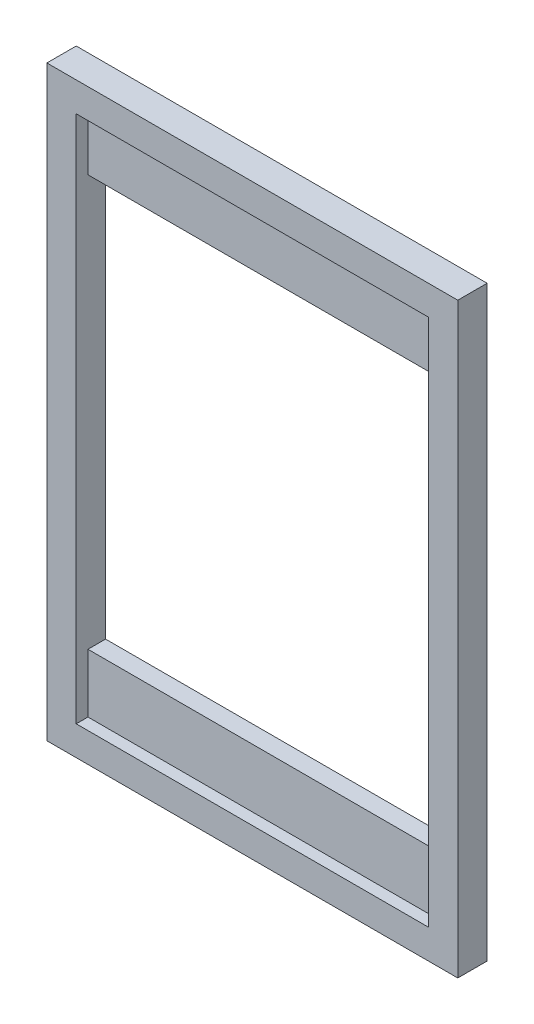
ISO-10303-21;
HEADER;
FILE_DESCRIPTION(('STEP AP214'),'2;1');
FILE_NAME('part.step','',(''),(''),'','','');
FILE_SCHEMA(('AUTOMOTIVE_DESIGN { 1 0 10303 214 1 1 1 1 }'));
ENDSEC;
DATA;
#1=APPLICATION_CONTEXT('core data for automotive mechanical design processes');
#2=APPLICATION_PROTOCOL_DEFINITION('international standard','automotive_design',2000,#1);
#3=PRODUCT_CONTEXT('',#1,'mechanical');
#4=PRODUCT('Part','Part','',(#3));
#5=PRODUCT_RELATED_PRODUCT_CATEGORY('part','',(#4));
#6=PRODUCT_DEFINITION_FORMATION('','',#4);
#7=PRODUCT_DEFINITION_CONTEXT('part definition',#1,'design');
#8=PRODUCT_DEFINITION('design','',#6,#7);
#9=PRODUCT_DEFINITION_SHAPE('','',#8);
#10=(LENGTH_UNIT() NAMED_UNIT(*) SI_UNIT(.MILLI.,.METRE.));
#11=(NAMED_UNIT(*) PLANE_ANGLE_UNIT() SI_UNIT($,.RADIAN.));
#12=(NAMED_UNIT(*) SI_UNIT($,.STERADIAN.) SOLID_ANGLE_UNIT());
#13=UNCERTAINTY_MEASURE_WITH_UNIT(LENGTH_MEASURE(1.E-05),#10,'distance_accuracy_value','');
#14=(GEOMETRIC_REPRESENTATION_CONTEXT(3) GLOBAL_UNCERTAINTY_ASSIGNED_CONTEXT((#13)) GLOBAL_UNIT_ASSIGNED_CONTEXT((#10,
#11,#12)) REPRESENTATION_CONTEXT('',''));
#15=CARTESIAN_POINT('',(0.,0.,0.));
#16=DIRECTION('',(0.,0.,1.));
#17=DIRECTION('',(1.,0.,0.));
#18=AXIS2_PLACEMENT_3D('',#15,#16,#17);
#19=CARTESIAN_POINT('',(-30.,-45.,0.));
#20=DIRECTION('',(1.,0.,0.));
#21=DIRECTION('',(0.,0.,-1.));
#22=AXIS2_PLACEMENT_3D('',#19,#20,#21);
#23=PLANE('',#22);
#24=DIRECTION('',(0.,0.,1.));
#25=VECTOR('',#24,1.);
#26=CARTESIAN_POINT('',(-30.,-45.,0.));
#27=LINE('',#26,#25);
#28=CARTESIAN_POINT('',(-30.,-45.,3.));
#29=VERTEX_POINT('',#28);
#30=CARTESIAN_POINT('',(-30.,-45.,5.));
#31=VERTEX_POINT('',#30);
#32=EDGE_CURVE('E69',#29,#31,#27,.T.);
#33=ORIENTED_EDGE('',*,*,#32,.F.);
#34=DIRECTION('',(0.,-1.,0.));
#35=VECTOR('',#34,1.);
#36=CARTESIAN_POINT('',(-30.,-35.,3.));
#37=LINE('',#36,#35);
#38=CARTESIAN_POINT('',(-30.,-35.,3.));
#39=VERTEX_POINT('',#38);
#40=EDGE_CURVE('E142',#39,#29,#37,.T.);
#41=ORIENTED_EDGE('',*,*,#40,.F.);
#42=DIRECTION('',(0.,0.,1.));
#43=VECTOR('',#42,1.);
#44=CARTESIAN_POINT('',(-30.,-35.,0.));
#45=LINE('',#44,#43);
#46=CARTESIAN_POINT('',(-30.,-35.,0.));
#47=VERTEX_POINT('',#46);
#48=EDGE_CURVE('E149',#47,#39,#45,.T.);
#49=ORIENTED_EDGE('',*,*,#48,.F.);
#50=DIRECTION('',(0.,1.,0.));
#51=VECTOR('',#50,1.);
#52=CARTESIAN_POINT('',(-30.,-45.,0.));
#53=LINE('',#52,#51);
#54=CARTESIAN_POINT('',(-30.,35.,0.));
#55=VERTEX_POINT('',#54);
#56=EDGE_CURVE('E192',#47,#55,#53,.T.);
#57=ORIENTED_EDGE('',*,*,#56,.T.);
#58=DIRECTION('',(0.,0.,-1.));
#59=VECTOR('',#58,1.);
#60=CARTESIAN_POINT('',(-30.,35.,3.));
#61=LINE('',#60,#59);
#62=CARTESIAN_POINT('',(-30.,35.,3.));
#63=VERTEX_POINT('',#62);
#64=EDGE_CURVE('E165',#63,#55,#61,.T.);
#65=ORIENTED_EDGE('',*,*,#64,.F.);
#66=DIRECTION('',(0.,1.,0.));
#67=VECTOR('',#66,1.);
#68=CARTESIAN_POINT('',(-30.,35.,3.));
#69=LINE('',#68,#67);
#70=CARTESIAN_POINT('',(-30.,45.,3.));
#71=VERTEX_POINT('',#70);
#72=EDGE_CURVE('E183',#63,#71,#69,.T.);
#73=ORIENTED_EDGE('',*,*,#72,.T.);
#74=DIRECTION('',(0.,0.,1.));
#75=VECTOR('',#74,1.);
#76=CARTESIAN_POINT('',(-30.,45.,0.));
#77=LINE('',#76,#75);
#78=CARTESIAN_POINT('',(-30.,45.,5.));
#79=VERTEX_POINT('',#78);
#80=EDGE_CURVE('E219',#71,#79,#77,.T.);
#81=ORIENTED_EDGE('',*,*,#80,.T.);
#82=DIRECTION('',(0.,1.,0.));
#83=VECTOR('',#82,1.);
#84=CARTESIAN_POINT('',(-30.,-45.,5.));
#85=LINE('',#84,#83);
#86=EDGE_CURVE('E191',#31,#79,#85,.T.);
#87=ORIENTED_EDGE('',*,*,#86,.F.);
#88=EDGE_LOOP('',(#33,#41,#49,#57,#65,#73,#81,#87));
#89=FACE_BOUND('',#88,.T.);
#90=ADVANCED_FACE('F45',(#89),#23,.T.);
#91=CARTESIAN_POINT('',(30.,-45.,0.));
#92=DIRECTION('',(1.,0.,0.));
#93=DIRECTION('',(0.,0.,-1.));
#94=AXIS2_PLACEMENT_3D('',#91,#92,#93);
#95=PLANE('',#94);
#96=DIRECTION('',(0.,-1.,0.));
#97=VECTOR('',#96,1.);
#98=CARTESIAN_POINT('',(30.,-35.,3.));
#99=LINE('',#98,#97);
#100=CARTESIAN_POINT('',(30.,-35.,3.));
#101=VERTEX_POINT('',#100);
#102=CARTESIAN_POINT('',(30.,-45.,3.));
#103=VERTEX_POINT('',#102);
#104=EDGE_CURVE('E144',#101,#103,#99,.T.);
#105=ORIENTED_EDGE('',*,*,#104,.T.);
#106=DIRECTION('',(0.,0.,1.));
#107=VECTOR('',#106,1.);
#108=CARTESIAN_POINT('',(30.,-45.,0.));
#109=LINE('',#108,#107);
#110=CARTESIAN_POINT('',(30.,-45.,5.));
#111=VERTEX_POINT('',#110);
#112=EDGE_CURVE('E213',#103,#111,#109,.T.);
#113=ORIENTED_EDGE('',*,*,#112,.T.);
#114=DIRECTION('',(0.,1.,0.));
#115=VECTOR('',#114,1.);
#116=CARTESIAN_POINT('',(30.,-45.,5.));
#117=LINE('',#116,#115);
#118=CARTESIAN_POINT('',(30.,45.,5.));
#119=VERTEX_POINT('',#118);
#120=EDGE_CURVE('E205',#111,#119,#117,.T.);
#121=ORIENTED_EDGE('',*,*,#120,.T.);
#122=DIRECTION('',(0.,0.,1.));
#123=VECTOR('',#122,1.);
#124=CARTESIAN_POINT('',(30.,45.,0.));
#125=LINE('',#124,#123);
#126=CARTESIAN_POINT('',(30.,45.,3.));
#127=VERTEX_POINT('',#126);
#128=EDGE_CURVE('E216',#127,#119,#125,.T.);
#129=ORIENTED_EDGE('',*,*,#128,.F.);
#130=DIRECTION('',(0.,1.,0.));
#131=VECTOR('',#130,1.);
#132=CARTESIAN_POINT('',(30.,35.,3.));
#133=LINE('',#132,#131);
#134=CARTESIAN_POINT('',(30.,35.,3.));
#135=VERTEX_POINT('',#134);
#136=EDGE_CURVE('E188',#135,#127,#133,.T.);
#137=ORIENTED_EDGE('',*,*,#136,.F.);
#138=DIRECTION('',(0.,0.,-1.));
#139=VECTOR('',#138,1.);
#140=CARTESIAN_POINT('',(30.,35.,3.));
#141=LINE('',#140,#139);
#142=CARTESIAN_POINT('',(30.,35.,0.));
#143=VERTEX_POINT('',#142);
#144=EDGE_CURVE('E176',#135,#143,#141,.T.);
#145=ORIENTED_EDGE('',*,*,#144,.T.);
#146=DIRECTION('',(0.,1.,0.));
#147=VECTOR('',#146,1.);
#148=CARTESIAN_POINT('',(30.,-45.,0.));
#149=LINE('',#148,#147);
#150=CARTESIAN_POINT('',(30.,-35.,0.));
#151=VERTEX_POINT('',#150);
#152=EDGE_CURVE('E61',#151,#143,#149,.T.);
#153=ORIENTED_EDGE('',*,*,#152,.F.);
#154=DIRECTION('',(0.,0.,1.));
#155=VECTOR('',#154,1.);
#156=CARTESIAN_POINT('',(30.,-35.,0.));
#157=LINE('',#156,#155);
#158=EDGE_CURVE('E148',#151,#101,#157,.T.);
#159=ORIENTED_EDGE('',*,*,#158,.T.);
#160=EDGE_LOOP('',(#105,#113,#121,#129,#137,#145,#153,#159));
#161=FACE_BOUND('',#160,.T.);
#162=ADVANCED_FACE('F286',(#161),#95,.F.);
#163=CARTESIAN_POINT('',(-30.,-45.,0.));
#164=DIRECTION('',(0.,-1.,0.));
#165=DIRECTION('',(0.,0.,-1.));
#166=AXIS2_PLACEMENT_3D('',#163,#164,#165);
#167=PLANE('',#166);
#168=DIRECTION('',(1.,0.,0.));
#169=VECTOR('',#168,1.);
#170=CARTESIAN_POINT('',(-30.,-45.,3.));
#171=LINE('',#170,#169);
#172=EDGE_CURVE('E157',#29,#103,#171,.T.);
#173=ORIENTED_EDGE('',*,*,#172,.F.);
#174=ORIENTED_EDGE('',*,*,#32,.T.);
#175=DIRECTION('',(1.,0.,0.));
#176=VECTOR('',#175,1.);
#177=CARTESIAN_POINT('',(-30.,-45.,5.));
#178=LINE('',#177,#176);
#179=EDGE_CURVE('E195',#31,#111,#178,.T.);
#180=ORIENTED_EDGE('',*,*,#179,.T.);
#181=ORIENTED_EDGE('',*,*,#112,.F.);
#182=EDGE_LOOP('',(#173,#174,#180,#181));
#183=FACE_BOUND('',#182,.T.);
#184=ADVANCED_FACE('F292',(#183),#167,.F.);
#185=CARTESIAN_POINT('',(0.,0.,5.));
#186=DIRECTION('',(0.,0.,-1.));
#187=DIRECTION('',(-1.,0.,0.));
#188=AXIS2_PLACEMENT_3D('',#185,#186,#187);
#189=PLANE('',#188);
#190=DIRECTION('',(-1.,0.,0.));
#191=VECTOR('',#190,1.);
#192=CARTESIAN_POINT('',(35.,50.,5.));
#193=LINE('',#192,#191);
#194=CARTESIAN_POINT('',(35.,50.,5.));
#195=VERTEX_POINT('',#194);
#196=CARTESIAN_POINT('',(-35.,50.,5.));
#197=VERTEX_POINT('',#196);
#198=EDGE_CURVE('E223',#195,#197,#193,.T.);
#199=ORIENTED_EDGE('',*,*,#198,.T.);
#200=DIRECTION('',(0.,-1.,0.));
#201=VECTOR('',#200,1.);
#202=CARTESIAN_POINT('',(-35.,-50.,5.));
#203=LINE('',#202,#201);
#204=CARTESIAN_POINT('',(-35.,-50.,5.));
#205=VERTEX_POINT('',#204);
#206=EDGE_CURVE('E227',#197,#205,#203,.T.);
#207=ORIENTED_EDGE('',*,*,#206,.T.);
#208=DIRECTION('',(1.,0.,0.));
#209=VECTOR('',#208,1.);
#210=CARTESIAN_POINT('',(35.,-50.,5.));
#211=LINE('',#210,#209);
#212=CARTESIAN_POINT('',(35.,-50.,5.));
#213=VERTEX_POINT('',#212);
#214=EDGE_CURVE('E231',#205,#213,#211,.T.);
#215=ORIENTED_EDGE('',*,*,#214,.T.);
#216=DIRECTION('',(0.,1.,0.));
#217=VECTOR('',#216,1.);
#218=CARTESIAN_POINT('',(35.,-50.,5.));
#219=LINE('',#218,#217);
#220=EDGE_CURVE('E234',#213,#195,#219,.T.);
#221=ORIENTED_EDGE('',*,*,#220,.T.);
#222=EDGE_LOOP('',(#199,#207,#215,#221));
#223=FACE_BOUND('',#222,.T.);
#224=ORIENTED_EDGE('',*,*,#86,.T.);
#225=DIRECTION('',(1.,0.,0.));
#226=VECTOR('',#225,1.);
#227=CARTESIAN_POINT('',(-30.,45.,5.));
#228=LINE('',#227,#226);
#229=EDGE_CURVE('E201',#79,#119,#228,.T.);
#230=ORIENTED_EDGE('',*,*,#229,.T.);
#231=ORIENTED_EDGE('',*,*,#120,.F.);
#232=ORIENTED_EDGE('',*,*,#179,.F.);
#233=EDGE_LOOP('',(#224,#230,#231,#232));
#234=FACE_BOUND('',#233,.T.);
#235=ADVANCED_FACE('F276',(#223,#234),#189,.F.);
#236=CARTESIAN_POINT('',(0.,0.,0.));
#237=DIRECTION('',(0.,0.,-1.));
#238=DIRECTION('',(-1.,0.,0.));
#239=AXIS2_PLACEMENT_3D('',#236,#237,#238);
#240=PLANE('',#239);
#241=ORIENTED_EDGE('',*,*,#56,.F.);
#242=DIRECTION('',(1.,0.,0.));
#243=VECTOR('',#242,1.);
#244=CARTESIAN_POINT('',(-30.,-35.,0.));
#245=LINE('',#244,#243);
#246=EDGE_CURVE('E153',#47,#151,#245,.T.);
#247=ORIENTED_EDGE('',*,*,#246,.T.);
#248=ORIENTED_EDGE('',*,*,#152,.T.);
#249=DIRECTION('',(1.,0.,0.));
#250=VECTOR('',#249,1.);
#251=CARTESIAN_POINT('',(-30.,35.,0.));
#252=LINE('',#251,#250);
#253=EDGE_CURVE('E173',#55,#143,#252,.T.);
#254=ORIENTED_EDGE('',*,*,#253,.F.);
#255=EDGE_LOOP('',(#241,#247,#248,#254));
#256=FACE_BOUND('',#255,.T.);
#257=DIRECTION('',(-1.,0.,0.));
#258=VECTOR('',#257,1.);
#259=CARTESIAN_POINT('',(35.,50.,0.));
#260=LINE('',#259,#258);
#261=CARTESIAN_POINT('',(35.,50.,0.));
#262=VERTEX_POINT('',#261);
#263=CARTESIAN_POINT('',(-35.,50.,0.));
#264=VERTEX_POINT('',#263);
#265=EDGE_CURVE('E222',#262,#264,#260,.T.);
#266=ORIENTED_EDGE('',*,*,#265,.F.);
#267=DIRECTION('',(0.,1.,0.));
#268=VECTOR('',#267,1.);
#269=CARTESIAN_POINT('',(35.,-50.,0.));
#270=LINE('',#269,#268);
#271=CARTESIAN_POINT('',(35.,-50.,0.));
#272=VERTEX_POINT('',#271);
#273=EDGE_CURVE('E228',#272,#262,#270,.T.);
#274=ORIENTED_EDGE('',*,*,#273,.F.);
#275=DIRECTION('',(1.,0.,0.));
#276=VECTOR('',#275,1.);
#277=CARTESIAN_POINT('',(35.,-50.,0.));
#278=LINE('',#277,#276);
#279=CARTESIAN_POINT('',(-35.,-50.,0.));
#280=VERTEX_POINT('',#279);
#281=EDGE_CURVE('E244',#280,#272,#278,.T.);
#282=ORIENTED_EDGE('',*,*,#281,.F.);
#283=DIRECTION('',(0.,-1.,0.));
#284=VECTOR('',#283,1.);
#285=CARTESIAN_POINT('',(-35.,-50.,0.));
#286=LINE('',#285,#284);
#287=EDGE_CURVE('E241',#264,#280,#286,.T.);
#288=ORIENTED_EDGE('',*,*,#287,.F.);
#289=EDGE_LOOP('',(#266,#274,#282,#288));
#290=FACE_BOUND('',#289,.T.);
#291=ADVANCED_FACE('F267',(#256,#290),#240,.T.);
#292=CARTESIAN_POINT('',(35.,50.,5.));
#293=DIRECTION('',(0.,-1.,0.));
#294=DIRECTION('',(0.,0.,-1.));
#295=AXIS2_PLACEMENT_3D('',#292,#293,#294);
#296=PLANE('',#295);
#297=ORIENTED_EDGE('',*,*,#265,.T.);
#298=DIRECTION('',(0.,0.,-1.));
#299=VECTOR('',#298,1.);
#300=CARTESIAN_POINT('',(-35.,50.,5.));
#301=LINE('',#300,#299);
#302=EDGE_CURVE('E11',#197,#264,#301,.T.);
#303=ORIENTED_EDGE('',*,*,#302,.F.);
#304=ORIENTED_EDGE('',*,*,#198,.F.);
#305=DIRECTION('',(0.,0.,-1.));
#306=VECTOR('',#305,1.);
#307=CARTESIAN_POINT('',(35.,50.,5.));
#308=LINE('',#307,#306);
#309=EDGE_CURVE('E237',#195,#262,#308,.T.);
#310=ORIENTED_EDGE('',*,*,#309,.T.);
#311=EDGE_LOOP('',(#297,#303,#304,#310));
#312=FACE_BOUND('',#311,.T.);
#313=ADVANCED_FACE('F47',(#312),#296,.F.);
#314=CARTESIAN_POINT('',(-35.,-50.,5.));
#315=DIRECTION('',(1.,0.,0.));
#316=DIRECTION('',(0.,0.,-1.));
#317=AXIS2_PLACEMENT_3D('',#314,#315,#316);
#318=PLANE('',#317);
#319=ORIENTED_EDGE('',*,*,#287,.T.);
#320=DIRECTION('',(0.,0.,-1.));
#321=VECTOR('',#320,1.);
#322=CARTESIAN_POINT('',(-35.,-50.,5.));
#323=LINE('',#322,#321);
#324=EDGE_CURVE('E54',#205,#280,#323,.T.);
#325=ORIENTED_EDGE('',*,*,#324,.F.);
#326=ORIENTED_EDGE('',*,*,#206,.F.);
#327=ORIENTED_EDGE('',*,*,#302,.T.);
#328=EDGE_LOOP('',(#319,#325,#326,#327));
#329=FACE_BOUND('',#328,.T.);
#330=ADVANCED_FACE('F278',(#329),#318,.F.);
#331=CARTESIAN_POINT('',(35.,-50.,5.));
#332=DIRECTION('',(0.,1.,0.));
#333=DIRECTION('',(0.,0.,1.));
#334=AXIS2_PLACEMENT_3D('',#331,#332,#333);
#335=PLANE('',#334);
#336=ORIENTED_EDGE('',*,*,#281,.T.);
#337=DIRECTION('',(0.,0.,-1.));
#338=VECTOR('',#337,1.);
#339=CARTESIAN_POINT('',(35.,-50.,5.));
#340=LINE('',#339,#338);
#341=EDGE_CURVE('E252',#213,#272,#340,.T.);
#342=ORIENTED_EDGE('',*,*,#341,.F.);
#343=ORIENTED_EDGE('',*,*,#214,.F.);
#344=ORIENTED_EDGE('',*,*,#324,.T.);
#345=EDGE_LOOP('',(#336,#342,#343,#344));
#346=FACE_BOUND('',#345,.T.);
#347=ADVANCED_FACE('F261',(#346),#335,.F.);
#348=CARTESIAN_POINT('',(35.,-50.,5.));
#349=DIRECTION('',(-1.,0.,0.));
#350=DIRECTION('',(0.,0.,1.));
#351=AXIS2_PLACEMENT_3D('',#348,#349,#350);
#352=PLANE('',#351);
#353=ORIENTED_EDGE('',*,*,#273,.T.);
#354=ORIENTED_EDGE('',*,*,#309,.F.);
#355=ORIENTED_EDGE('',*,*,#220,.F.);
#356=ORIENTED_EDGE('',*,*,#341,.T.);
#357=EDGE_LOOP('',(#353,#354,#355,#356));
#358=FACE_BOUND('',#357,.T.);
#359=ADVANCED_FACE('F270',(#358),#352,.F.);
#360=CARTESIAN_POINT('',(-30.,45.,0.));
#361=DIRECTION('',(0.,-1.,0.));
#362=DIRECTION('',(0.,0.,-1.));
#363=AXIS2_PLACEMENT_3D('',#360,#361,#362);
#364=PLANE('',#363);
#365=DIRECTION('',(1.,0.,0.));
#366=VECTOR('',#365,1.);
#367=CARTESIAN_POINT('',(-30.,45.,3.));
#368=LINE('',#367,#366);
#369=EDGE_CURVE('E160',#71,#127,#368,.T.);
#370=ORIENTED_EDGE('',*,*,#369,.T.);
#371=ORIENTED_EDGE('',*,*,#128,.T.);
#372=ORIENTED_EDGE('',*,*,#229,.F.);
#373=ORIENTED_EDGE('',*,*,#80,.F.);
#374=EDGE_LOOP('',(#370,#371,#372,#373));
#375=FACE_BOUND('',#374,.T.);
#376=ADVANCED_FACE('F297',(#375),#364,.T.);
#377=CARTESIAN_POINT('',(-30.,35.,3.));
#378=DIRECTION('',(0.,0.,1.));
#379=DIRECTION('',(1.,0.,0.));
#380=AXIS2_PLACEMENT_3D('',#377,#378,#379);
#381=PLANE('',#380);
#382=ORIENTED_EDGE('',*,*,#369,.F.);
#383=ORIENTED_EDGE('',*,*,#72,.F.);
#384=DIRECTION('',(1.,0.,0.));
#385=VECTOR('',#384,1.);
#386=CARTESIAN_POINT('',(-30.,35.,3.));
#387=LINE('',#386,#385);
#388=EDGE_CURVE('E180',#63,#135,#387,.T.);
#389=ORIENTED_EDGE('',*,*,#388,.T.);
#390=ORIENTED_EDGE('',*,*,#136,.T.);
#391=EDGE_LOOP('',(#382,#383,#389,#390));
#392=FACE_BOUND('',#391,.T.);
#393=ADVANCED_FACE('F306',(#392),#381,.T.);
#394=CARTESIAN_POINT('',(0.,35.,0.));
#395=DIRECTION('',(0.,-1.,0.));
#396=DIRECTION('',(0.,0.,-1.));
#397=AXIS2_PLACEMENT_3D('',#394,#395,#396);
#398=PLANE('',#397);
#399=ORIENTED_EDGE('',*,*,#64,.T.);
#400=ORIENTED_EDGE('',*,*,#253,.T.);
#401=ORIENTED_EDGE('',*,*,#144,.F.);
#402=ORIENTED_EDGE('',*,*,#388,.F.);
#403=EDGE_LOOP('',(#399,#400,#401,#402));
#404=FACE_BOUND('',#403,.T.);
#405=ADVANCED_FACE('F311',(#404),#398,.T.);
#406=CARTESIAN_POINT('',(-30.,-35.,3.));
#407=DIRECTION('',(0.,0.,-1.));
#408=DIRECTION('',(-1.,0.,0.));
#409=AXIS2_PLACEMENT_3D('',#406,#407,#408);
#410=PLANE('',#409);
#411=ORIENTED_EDGE('',*,*,#172,.T.);
#412=ORIENTED_EDGE('',*,*,#104,.F.);
#413=DIRECTION('',(1.,0.,0.));
#414=VECTOR('',#413,1.);
#415=CARTESIAN_POINT('',(-30.,-35.,3.));
#416=LINE('',#415,#414);
#417=EDGE_CURVE('E138',#39,#101,#416,.T.);
#418=ORIENTED_EDGE('',*,*,#417,.F.);
#419=ORIENTED_EDGE('',*,*,#40,.T.);
#420=EDGE_LOOP('',(#411,#412,#418,#419));
#421=FACE_BOUND('',#420,.T.);
#422=ADVANCED_FACE('F140',(#421),#410,.F.);
#423=CARTESIAN_POINT('',(0.,-35.,0.));
#424=DIRECTION('',(0.,1.,0.));
#425=DIRECTION('',(0.,0.,1.));
#426=AXIS2_PLACEMENT_3D('',#423,#424,#425);
#427=PLANE('',#426);
#428=ORIENTED_EDGE('',*,*,#48,.T.);
#429=ORIENTED_EDGE('',*,*,#417,.T.);
#430=ORIENTED_EDGE('',*,*,#158,.F.);
#431=ORIENTED_EDGE('',*,*,#246,.F.);
#432=EDGE_LOOP('',(#428,#429,#430,#431));
#433=FACE_BOUND('',#432,.T.);
#434=ADVANCED_FACE('F152',(#433),#427,.T.);
#435=CLOSED_SHELL('',(#90,#162,#184,#235,#291,#313,#330,#347,#359,#376,#393,#405,#422,#434));
#436=MANIFOLD_SOLID_BREP('B2',#435);
#437=ADVANCED_BREP_SHAPE_REPRESENTATION('',(#18,#436),#14);
#438=SHAPE_DEFINITION_REPRESENTATION(#9,#437);
ENDSEC;
END-ISO-10303-21;
